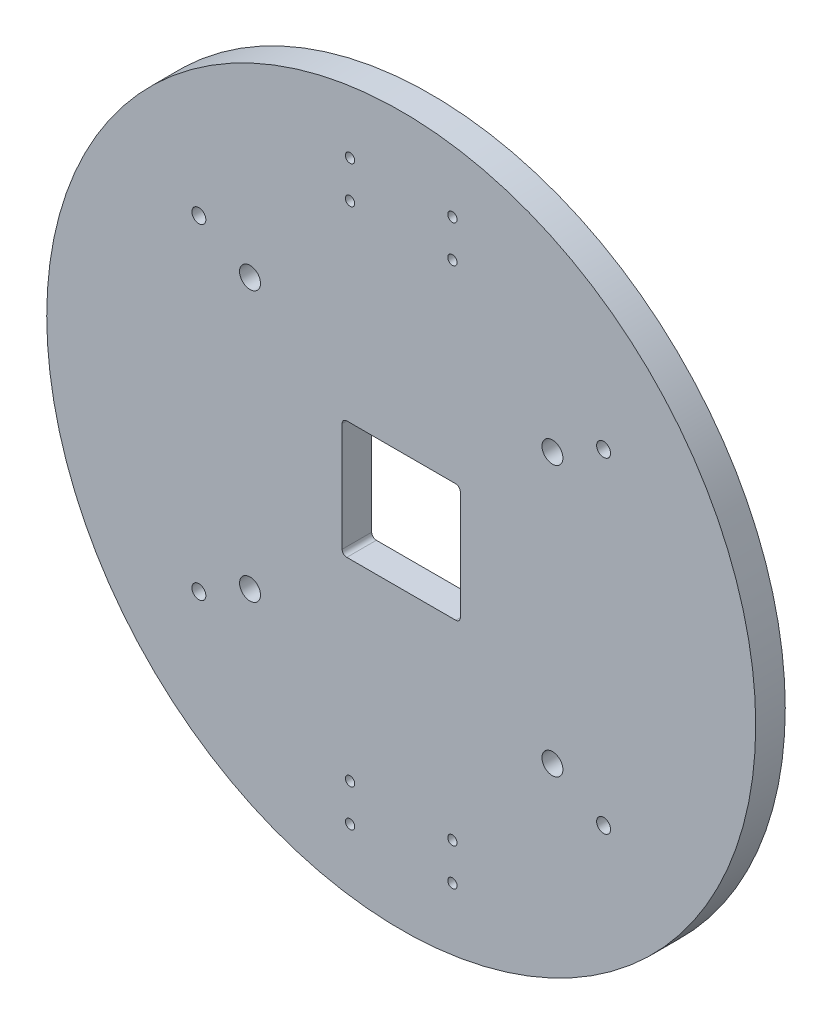
ISO-10303-21;
HEADER;
FILE_DESCRIPTION(('STEP AP214'),'2;1');
FILE_NAME('part.step','',(''),(''),'','','');
FILE_SCHEMA(('AUTOMOTIVE_DESIGN { 1 0 10303 214 1 1 1 1 }'));
ENDSEC;
DATA;
#1=APPLICATION_CONTEXT('core data for automotive mechanical design processes');
#2=APPLICATION_PROTOCOL_DEFINITION('international standard','automotive_design',2000,#1);
#3=PRODUCT_CONTEXT('',#1,'mechanical');
#4=PRODUCT('Part','Part','',(#3));
#5=PRODUCT_RELATED_PRODUCT_CATEGORY('part','',(#4));
#6=PRODUCT_DEFINITION_FORMATION('','',#4);
#7=PRODUCT_DEFINITION_CONTEXT('part definition',#1,'design');
#8=PRODUCT_DEFINITION('design','',#6,#7);
#9=PRODUCT_DEFINITION_SHAPE('','',#8);
#10=(LENGTH_UNIT() NAMED_UNIT(*) SI_UNIT(.MILLI.,.METRE.));
#11=(NAMED_UNIT(*) PLANE_ANGLE_UNIT() SI_UNIT($,.RADIAN.));
#12=(NAMED_UNIT(*) SI_UNIT($,.STERADIAN.) SOLID_ANGLE_UNIT());
#13=UNCERTAINTY_MEASURE_WITH_UNIT(LENGTH_MEASURE(1.E-05),#10,'distance_accuracy_value','');
#14=(GEOMETRIC_REPRESENTATION_CONTEXT(3) GLOBAL_UNCERTAINTY_ASSIGNED_CONTEXT((#13)) GLOBAL_UNIT_ASSIGNED_CONTEXT((#10,
#11,#12)) REPRESENTATION_CONTEXT('',''));
#15=CARTESIAN_POINT('',(0.,0.,0.));
#16=DIRECTION('',(0.,0.,1.));
#17=DIRECTION('',(1.,0.,0.));
#18=AXIS2_PLACEMENT_3D('',#15,#16,#17);
#19=CARTESIAN_POINT('',(0.,0.,6.35));
#20=DIRECTION('',(0.,0.,1.));
#21=DIRECTION('',(1.,0.,0.));
#22=AXIS2_PLACEMENT_3D('',#19,#20,#21);
#23=PLANE('',#22);
#24=CARTESIAN_POINT('',(11.,-62.,6.35));
#25=DIRECTION('',(0.,0.,1.));
#26=DIRECTION('',(1.,0.,0.));
#27=AXIS2_PLACEMENT_3D('',#24,#25,#26);
#28=CIRCLE('',#27,0.999999999999997);
#29=CARTESIAN_POINT('',(12.,-62.,6.35));
#30=VERTEX_POINT('',#29);
#31=EDGE_CURVE('E570',#30,#30,#28,.T.);
#32=ORIENTED_EDGE('',*,*,#31,.F.);
#33=EDGE_LOOP('',(#32));
#34=FACE_BOUND('',#33,.T.);
#35=CARTESIAN_POINT('',(-11.,-62.,6.35));
#36=DIRECTION('',(0.,0.,1.));
#37=DIRECTION('',(1.,0.,0.));
#38=AXIS2_PLACEMENT_3D('',#35,#36,#37);
#39=CIRCLE('',#38,1.00000000000001);
#40=CARTESIAN_POINT('',(-9.99999999999999,-62.,6.35));
#41=VERTEX_POINT('',#40);
#42=EDGE_CURVE('E582',#41,#41,#39,.T.);
#43=ORIENTED_EDGE('',*,*,#42,.F.);
#44=EDGE_LOOP('',(#43));
#45=FACE_BOUND('',#44,.T.);
#46=CARTESIAN_POINT('',(11.,62.,6.35));
#47=DIRECTION('',(0.,0.,1.));
#48=DIRECTION('',(1.,0.,0.));
#49=AXIS2_PLACEMENT_3D('',#46,#47,#48);
#50=CIRCLE('',#49,1.);
#51=CARTESIAN_POINT('',(12.,62.,6.35));
#52=VERTEX_POINT('',#51);
#53=EDGE_CURVE('E594',#52,#52,#50,.T.);
#54=ORIENTED_EDGE('',*,*,#53,.F.);
#55=EDGE_LOOP('',(#54));
#56=FACE_BOUND('',#55,.T.);
#57=CARTESIAN_POINT('',(-11.,54.,6.35));
#58=DIRECTION('',(0.,0.,1.));
#59=DIRECTION('',(1.,0.,0.));
#60=AXIS2_PLACEMENT_3D('',#57,#58,#59);
#61=CIRCLE('',#60,0.999999999999998);
#62=CARTESIAN_POINT('',(-10.,54.,6.35));
#63=VERTEX_POINT('',#62);
#64=EDGE_CURVE('E606',#63,#63,#61,.T.);
#65=ORIENTED_EDGE('',*,*,#64,.F.);
#66=EDGE_LOOP('',(#65));
#67=FACE_BOUND('',#66,.T.);
#68=CARTESIAN_POINT('',(-43.5,-35.,6.35));
#69=DIRECTION('',(0.,0.,1.));
#70=DIRECTION('',(1.,0.,0.));
#71=AXIS2_PLACEMENT_3D('',#68,#69,#70);
#72=CIRCLE('',#71,1.5);
#73=CARTESIAN_POINT('',(-42.,-35.,6.35));
#74=VERTEX_POINT('',#73);
#75=EDGE_CURVE('E618',#74,#74,#72,.T.);
#76=ORIENTED_EDGE('',*,*,#75,.F.);
#77=EDGE_LOOP('',(#76));
#78=FACE_BOUND('',#77,.T.);
#79=CARTESIAN_POINT('',(43.5,35.,6.35));
#80=DIRECTION('',(0.,0.,1.));
#81=DIRECTION('',(1.,0.,0.));
#82=AXIS2_PLACEMENT_3D('',#79,#80,#81);
#83=CIRCLE('',#82,1.5);
#84=CARTESIAN_POINT('',(45.,35.,6.35));
#85=VERTEX_POINT('',#84);
#86=EDGE_CURVE('E630',#85,#85,#83,.T.);
#87=ORIENTED_EDGE('',*,*,#86,.F.);
#88=EDGE_LOOP('',(#87));
#89=FACE_BOUND('',#88,.T.);
#90=CARTESIAN_POINT('',(-32.5,-29.,6.35));
#91=DIRECTION('',(0.,0.,1.));
#92=DIRECTION('',(1.,0.,0.));
#93=AXIS2_PLACEMENT_3D('',#90,#91,#92);
#94=CIRCLE('',#93,2.25);
#95=CARTESIAN_POINT('',(-30.25,-29.,6.35));
#96=VERTEX_POINT('',#95);
#97=EDGE_CURVE('E491',#96,#96,#94,.T.);
#98=ORIENTED_EDGE('',*,*,#97,.F.);
#99=EDGE_LOOP('',(#98));
#100=FACE_BOUND('',#99,.T.);
#101=CARTESIAN_POINT('',(32.5,29.,6.35));
#102=DIRECTION('',(0.,0.,1.));
#103=DIRECTION('',(1.,0.,0.));
#104=AXIS2_PLACEMENT_3D('',#101,#102,#103);
#105=CIRCLE('',#104,2.25);
#106=CARTESIAN_POINT('',(34.75,29.,6.35));
#107=VERTEX_POINT('',#106);
#108=EDGE_CURVE('E120',#107,#107,#105,.T.);
#109=ORIENTED_EDGE('',*,*,#108,.F.);
#110=EDGE_LOOP('',(#109));
#111=FACE_BOUND('',#110,.T.);
#112=CARTESIAN_POINT('',(0.,0.,6.35));
#113=DIRECTION('',(0.,0.,1.));
#114=DIRECTION('',(1.,0.,0.));
#115=AXIS2_PLACEMENT_3D('',#112,#113,#114);
#116=CIRCLE('',#115,76.2);
#117=CARTESIAN_POINT('',(76.2,0.,6.35));
#118=VERTEX_POINT('',#117);
#119=EDGE_CURVE('E137',#118,#118,#116,.T.);
#120=ORIENTED_EDGE('',*,*,#119,.T.);
#121=EDGE_LOOP('',(#120));
#122=FACE_BOUND('',#121,.T.);
#123=DIRECTION('',(1.,0.,0.));
#124=VECTOR('',#123,1.);
#125=CARTESIAN_POINT('',(12.7,-12.7,6.35));
#126=LINE('',#125,#124);
#127=CARTESIAN_POINT('',(-11.7,-12.7,6.35));
#128=VERTEX_POINT('',#127);
#129=CARTESIAN_POINT('',(11.7,-12.7,6.35));
#130=VERTEX_POINT('',#129);
#131=EDGE_CURVE('E186',#128,#130,#126,.T.);
#132=ORIENTED_EDGE('',*,*,#131,.F.);
#133=CARTESIAN_POINT('',(-11.7,-11.7,6.35));
#134=DIRECTION('',(0.,0.,1.));
#135=DIRECTION('',(1.,0.,0.));
#136=AXIS2_PLACEMENT_3D('',#133,#134,#135);
#137=CIRCLE('',#136,1.);
#138=CARTESIAN_POINT('',(-12.7,-11.7,6.35));
#139=VERTEX_POINT('',#138);
#140=EDGE_CURVE('E130',#128,#139,#137,.F.);
#141=ORIENTED_EDGE('',*,*,#140,.T.);
#142=DIRECTION('',(0.,-1.,0.));
#143=VECTOR('',#142,1.);
#144=CARTESIAN_POINT('',(-12.7,12.7,6.35));
#145=LINE('',#144,#143);
#146=CARTESIAN_POINT('',(-12.7,11.7,6.35));
#147=VERTEX_POINT('',#146);
#148=EDGE_CURVE('E134',#147,#139,#145,.T.);
#149=ORIENTED_EDGE('',*,*,#148,.F.);
#150=CARTESIAN_POINT('',(-11.7,11.7,6.35));
#151=DIRECTION('',(0.,0.,1.));
#152=DIRECTION('',(1.,0.,0.));
#153=AXIS2_PLACEMENT_3D('',#150,#151,#152);
#154=CIRCLE('',#153,1.);
#155=CARTESIAN_POINT('',(-11.7,12.7,6.35));
#156=VERTEX_POINT('',#155);
#157=EDGE_CURVE('E172',#147,#156,#154,.F.);
#158=ORIENTED_EDGE('',*,*,#157,.T.);
#159=DIRECTION('',(-1.,0.,0.));
#160=VECTOR('',#159,1.);
#161=CARTESIAN_POINT('',(12.7,12.7,6.35));
#162=LINE('',#161,#160);
#163=CARTESIAN_POINT('',(11.7,12.7,6.35));
#164=VERTEX_POINT('',#163);
#165=EDGE_CURVE('E209',#164,#156,#162,.T.);
#166=ORIENTED_EDGE('',*,*,#165,.F.);
#167=CARTESIAN_POINT('',(11.7,11.7,6.35));
#168=DIRECTION('',(0.,0.,1.));
#169=DIRECTION('',(1.,0.,0.));
#170=AXIS2_PLACEMENT_3D('',#167,#168,#169);
#171=CIRCLE('',#170,1.);
#172=CARTESIAN_POINT('',(12.7,11.7,6.35));
#173=VERTEX_POINT('',#172);
#174=EDGE_CURVE('E159',#164,#173,#171,.F.);
#175=ORIENTED_EDGE('',*,*,#174,.T.);
#176=DIRECTION('',(0.,1.,0.));
#177=VECTOR('',#176,1.);
#178=CARTESIAN_POINT('',(12.7,12.7,6.35));
#179=LINE('',#178,#177);
#180=CARTESIAN_POINT('',(12.7,-11.7,6.35));
#181=VERTEX_POINT('',#180);
#182=EDGE_CURVE('E202',#181,#173,#179,.T.);
#183=ORIENTED_EDGE('',*,*,#182,.F.);
#184=CARTESIAN_POINT('',(11.7,-11.7,6.35));
#185=DIRECTION('',(0.,0.,1.));
#186=DIRECTION('',(1.,0.,0.));
#187=AXIS2_PLACEMENT_3D('',#184,#185,#186);
#188=CIRCLE('',#187,1.);
#189=EDGE_CURVE('E11',#181,#130,#188,.F.);
#190=ORIENTED_EDGE('',*,*,#189,.T.);
#191=EDGE_LOOP('',(#132,#141,#149,#158,#166,#175,#183,#190));
#192=FACE_BOUND('',#191,.T.);
#193=CARTESIAN_POINT('',(-32.5,29.,6.35));
#194=DIRECTION('',(0.,0.,1.));
#195=DIRECTION('',(1.,0.,0.));
#196=AXIS2_PLACEMENT_3D('',#193,#194,#195);
#197=CIRCLE('',#196,2.25);
#198=CARTESIAN_POINT('',(-30.25,29.,6.35));
#199=VERTEX_POINT('',#198);
#200=EDGE_CURVE('E485',#199,#199,#197,.T.);
#201=ORIENTED_EDGE('',*,*,#200,.F.);
#202=EDGE_LOOP('',(#201));
#203=FACE_BOUND('',#202,.T.);
#204=CARTESIAN_POINT('',(32.5,-29.,6.35));
#205=DIRECTION('',(0.,0.,1.));
#206=DIRECTION('',(1.,0.,0.));
#207=AXIS2_PLACEMENT_3D('',#204,#205,#206);
#208=CIRCLE('',#207,2.25);
#209=CARTESIAN_POINT('',(34.75,-29.,6.35));
#210=VERTEX_POINT('',#209);
#211=EDGE_CURVE('E636',#210,#210,#208,.T.);
#212=ORIENTED_EDGE('',*,*,#211,.F.);
#213=EDGE_LOOP('',(#212));
#214=FACE_BOUND('',#213,.T.);
#215=CARTESIAN_POINT('',(-43.5,35.,6.35));
#216=DIRECTION('',(0.,0.,1.));
#217=DIRECTION('',(1.,0.,0.));
#218=AXIS2_PLACEMENT_3D('',#215,#216,#217);
#219=CIRCLE('',#218,1.5);
#220=CARTESIAN_POINT('',(-42.,35.,6.35));
#221=VERTEX_POINT('',#220);
#222=EDGE_CURVE('E624',#221,#221,#219,.T.);
#223=ORIENTED_EDGE('',*,*,#222,.F.);
#224=EDGE_LOOP('',(#223));
#225=FACE_BOUND('',#224,.T.);
#226=CARTESIAN_POINT('',(43.5,-35.,6.35));
#227=DIRECTION('',(0.,0.,1.));
#228=DIRECTION('',(1.,0.,0.));
#229=AXIS2_PLACEMENT_3D('',#226,#227,#228);
#230=CIRCLE('',#229,1.5);
#231=CARTESIAN_POINT('',(45.,-35.,6.35));
#232=VERTEX_POINT('',#231);
#233=EDGE_CURVE('E612',#232,#232,#230,.T.);
#234=ORIENTED_EDGE('',*,*,#233,.F.);
#235=EDGE_LOOP('',(#234));
#236=FACE_BOUND('',#235,.T.);
#237=CARTESIAN_POINT('',(11.,54.,6.35));
#238=DIRECTION('',(0.,0.,1.));
#239=DIRECTION('',(1.,0.,0.));
#240=AXIS2_PLACEMENT_3D('',#237,#238,#239);
#241=CIRCLE('',#240,1.);
#242=CARTESIAN_POINT('',(12.,54.,6.35));
#243=VERTEX_POINT('',#242);
#244=EDGE_CURVE('E600',#243,#243,#241,.T.);
#245=ORIENTED_EDGE('',*,*,#244,.F.);
#246=EDGE_LOOP('',(#245));
#247=FACE_BOUND('',#246,.T.);
#248=CARTESIAN_POINT('',(-11.,62.,6.35));
#249=DIRECTION('',(0.,0.,1.));
#250=DIRECTION('',(1.,0.,0.));
#251=AXIS2_PLACEMENT_3D('',#248,#249,#250);
#252=CIRCLE('',#251,1.);
#253=CARTESIAN_POINT('',(-10.,62.,6.35));
#254=VERTEX_POINT('',#253);
#255=EDGE_CURVE('E588',#254,#254,#252,.T.);
#256=ORIENTED_EDGE('',*,*,#255,.F.);
#257=EDGE_LOOP('',(#256));
#258=FACE_BOUND('',#257,.T.);
#259=CARTESIAN_POINT('',(-11.,-54.,6.35));
#260=DIRECTION('',(0.,0.,1.));
#261=DIRECTION('',(1.,0.,0.));
#262=AXIS2_PLACEMENT_3D('',#259,#260,#261);
#263=CIRCLE('',#262,1.);
#264=CARTESIAN_POINT('',(-9.99999999999999,-54.,6.35));
#265=VERTEX_POINT('',#264);
#266=EDGE_CURVE('E576',#265,#265,#263,.T.);
#267=ORIENTED_EDGE('',*,*,#266,.F.);
#268=EDGE_LOOP('',(#267));
#269=FACE_BOUND('',#268,.T.);
#270=CARTESIAN_POINT('',(11.,-54.,6.35));
#271=DIRECTION('',(0.,0.,1.));
#272=DIRECTION('',(1.,0.,0.));
#273=AXIS2_PLACEMENT_3D('',#270,#271,#272);
#274=CIRCLE('',#273,1.);
#275=CARTESIAN_POINT('',(12.,-54.,6.35));
#276=VERTEX_POINT('',#275);
#277=EDGE_CURVE('E564',#276,#276,#274,.T.);
#278=ORIENTED_EDGE('',*,*,#277,.F.);
#279=EDGE_LOOP('',(#278));
#280=FACE_BOUND('',#279,.T.);
#281=ADVANCED_FACE('F45',(#34,#45,#56,#67,#78,#89,#100,#111,#122,#192,#203,#214,#225,#236,#247,
#258,#269,#280),#23,.T.);
#282=CARTESIAN_POINT('',(0.,0.,0.));
#283=DIRECTION('',(0.,0.,1.));
#284=DIRECTION('',(1.,0.,0.));
#285=AXIS2_PLACEMENT_3D('',#282,#283,#284);
#286=PLANE('',#285);
#287=CARTESIAN_POINT('',(0.,0.,0.));
#288=DIRECTION('',(0.,0.,1.));
#289=DIRECTION('',(1.,0.,0.));
#290=AXIS2_PLACEMENT_3D('',#287,#288,#289);
#291=CIRCLE('',#290,76.2);
#292=CARTESIAN_POINT('',(76.2,0.,0.));
#293=VERTEX_POINT('',#292);
#294=EDGE_CURVE('E143',#293,#293,#291,.T.);
#295=ORIENTED_EDGE('',*,*,#294,.F.);
#296=EDGE_LOOP('',(#295));
#297=FACE_BOUND('',#296,.T.);
#298=DIRECTION('',(-1.,0.,0.));
#299=VECTOR('',#298,1.);
#300=CARTESIAN_POINT('',(12.7,12.7,0.));
#301=LINE('',#300,#299);
#302=CARTESIAN_POINT('',(11.7,12.7,0.));
#303=VERTEX_POINT('',#302);
#304=CARTESIAN_POINT('',(-11.7,12.7,0.));
#305=VERTEX_POINT('',#304);
#306=EDGE_CURVE('E193',#303,#305,#301,.T.);
#307=ORIENTED_EDGE('',*,*,#306,.T.);
#308=CARTESIAN_POINT('',(-11.7,11.7,0.));
#309=DIRECTION('',(0.,0.,1.));
#310=DIRECTION('',(1.,0.,0.));
#311=AXIS2_PLACEMENT_3D('',#308,#309,#310);
#312=CIRCLE('',#311,1.);
#313=CARTESIAN_POINT('',(-12.7,11.7,0.));
#314=VERTEX_POINT('',#313);
#315=EDGE_CURVE('E114',#305,#314,#312,.T.);
#316=ORIENTED_EDGE('',*,*,#315,.T.);
#317=DIRECTION('',(0.,-1.,0.));
#318=VECTOR('',#317,1.);
#319=CARTESIAN_POINT('',(-12.7,12.7,0.));
#320=LINE('',#319,#318);
#321=CARTESIAN_POINT('',(-12.7,-11.7,0.));
#322=VERTEX_POINT('',#321);
#323=EDGE_CURVE('E107',#314,#322,#320,.T.);
#324=ORIENTED_EDGE('',*,*,#323,.T.);
#325=CARTESIAN_POINT('',(-11.7,-11.7,0.));
#326=DIRECTION('',(0.,0.,1.));
#327=DIRECTION('',(1.,0.,0.));
#328=AXIS2_PLACEMENT_3D('',#325,#326,#327);
#329=CIRCLE('',#328,1.);
#330=CARTESIAN_POINT('',(-11.7,-12.7,0.));
#331=VERTEX_POINT('',#330);
#332=EDGE_CURVE('E112',#322,#331,#329,.T.);
#333=ORIENTED_EDGE('',*,*,#332,.T.);
#334=DIRECTION('',(1.,0.,0.));
#335=VECTOR('',#334,1.);
#336=CARTESIAN_POINT('',(12.7,-12.7,0.));
#337=LINE('',#336,#335);
#338=CARTESIAN_POINT('',(11.7,-12.7,0.));
#339=VERTEX_POINT('',#338);
#340=EDGE_CURVE('E119',#331,#339,#337,.T.);
#341=ORIENTED_EDGE('',*,*,#340,.T.);
#342=CARTESIAN_POINT('',(11.7,-11.7,0.));
#343=DIRECTION('',(0.,0.,1.));
#344=DIRECTION('',(1.,0.,0.));
#345=AXIS2_PLACEMENT_3D('',#342,#343,#344);
#346=CIRCLE('',#345,1.);
#347=CARTESIAN_POINT('',(12.7,-11.7,0.));
#348=VERTEX_POINT('',#347);
#349=EDGE_CURVE('E54',#339,#348,#346,.T.);
#350=ORIENTED_EDGE('',*,*,#349,.T.);
#351=DIRECTION('',(0.,1.,0.));
#352=VECTOR('',#351,1.);
#353=CARTESIAN_POINT('',(12.7,12.7,0.));
#354=LINE('',#353,#352);
#355=CARTESIAN_POINT('',(12.7,11.7,0.));
#356=VERTEX_POINT('',#355);
#357=EDGE_CURVE('E190',#348,#356,#354,.T.);
#358=ORIENTED_EDGE('',*,*,#357,.T.);
#359=CARTESIAN_POINT('',(11.7,11.7,0.));
#360=DIRECTION('',(0.,0.,1.));
#361=DIRECTION('',(1.,0.,0.));
#362=AXIS2_PLACEMENT_3D('',#359,#360,#361);
#363=CIRCLE('',#362,1.);
#364=EDGE_CURVE('E156',#356,#303,#363,.T.);
#365=ORIENTED_EDGE('',*,*,#364,.T.);
#366=EDGE_LOOP('',(#307,#316,#324,#333,#341,#350,#358,#365));
#367=FACE_BOUND('',#366,.T.);
#368=CARTESIAN_POINT('',(32.5,29.,0.));
#369=DIRECTION('',(0.,0.,1.));
#370=DIRECTION('',(1.,0.,0.));
#371=AXIS2_PLACEMENT_3D('',#368,#369,#370);
#372=CIRCLE('',#371,2.25);
#373=CARTESIAN_POINT('',(34.75,29.,0.));
#374=VERTEX_POINT('',#373);
#375=EDGE_CURVE('E205',#374,#374,#372,.T.);
#376=ORIENTED_EDGE('',*,*,#375,.T.);
#377=EDGE_LOOP('',(#376));
#378=FACE_BOUND('',#377,.T.);
#379=CARTESIAN_POINT('',(-32.5,29.,0.));
#380=DIRECTION('',(0.,0.,1.));
#381=DIRECTION('',(1.,0.,0.));
#382=AXIS2_PLACEMENT_3D('',#379,#380,#381);
#383=CIRCLE('',#382,2.25);
#384=CARTESIAN_POINT('',(-30.25,29.,0.));
#385=VERTEX_POINT('',#384);
#386=EDGE_CURVE('E488',#385,#385,#383,.T.);
#387=ORIENTED_EDGE('',*,*,#386,.T.);
#388=EDGE_LOOP('',(#387));
#389=FACE_BOUND('',#388,.T.);
#390=CARTESIAN_POINT('',(-32.5,-29.,0.));
#391=DIRECTION('',(0.,0.,1.));
#392=DIRECTION('',(1.,0.,0.));
#393=AXIS2_PLACEMENT_3D('',#390,#391,#392);
#394=CIRCLE('',#393,2.25);
#395=CARTESIAN_POINT('',(-30.25,-29.,0.));
#396=VERTEX_POINT('',#395);
#397=EDGE_CURVE('E497',#396,#396,#394,.T.);
#398=ORIENTED_EDGE('',*,*,#397,.T.);
#399=EDGE_LOOP('',(#398));
#400=FACE_BOUND('',#399,.T.);
#401=CARTESIAN_POINT('',(32.5,-29.,0.));
#402=DIRECTION('',(0.,0.,1.));
#403=DIRECTION('',(1.,0.,0.));
#404=AXIS2_PLACEMENT_3D('',#401,#402,#403);
#405=CIRCLE('',#404,2.25);
#406=CARTESIAN_POINT('',(34.75,-29.,0.));
#407=VERTEX_POINT('',#406);
#408=EDGE_CURVE('E514',#407,#407,#405,.T.);
#409=ORIENTED_EDGE('',*,*,#408,.T.);
#410=EDGE_LOOP('',(#409));
#411=FACE_BOUND('',#410,.T.);
#412=CARTESIAN_POINT('',(43.5,35.,0.));
#413=DIRECTION('',(0.,0.,1.));
#414=DIRECTION('',(1.,0.,0.));
#415=AXIS2_PLACEMENT_3D('',#412,#413,#414);
#416=CIRCLE('',#415,1.5);
#417=CARTESIAN_POINT('',(45.,35.,0.));
#418=VERTEX_POINT('',#417);
#419=EDGE_CURVE('E518',#418,#418,#416,.T.);
#420=ORIENTED_EDGE('',*,*,#419,.T.);
#421=EDGE_LOOP('',(#420));
#422=FACE_BOUND('',#421,.T.);
#423=CARTESIAN_POINT('',(-43.5,35.,0.));
#424=DIRECTION('',(0.,0.,1.));
#425=DIRECTION('',(1.,0.,0.));
#426=AXIS2_PLACEMENT_3D('',#423,#424,#425);
#427=CIRCLE('',#426,1.5);
#428=CARTESIAN_POINT('',(-42.,35.,0.));
#429=VERTEX_POINT('',#428);
#430=EDGE_CURVE('E522',#429,#429,#427,.T.);
#431=ORIENTED_EDGE('',*,*,#430,.T.);
#432=EDGE_LOOP('',(#431));
#433=FACE_BOUND('',#432,.T.);
#434=CARTESIAN_POINT('',(-43.5,-35.,0.));
#435=DIRECTION('',(0.,0.,1.));
#436=DIRECTION('',(1.,0.,0.));
#437=AXIS2_PLACEMENT_3D('',#434,#435,#436);
#438=CIRCLE('',#437,1.5);
#439=CARTESIAN_POINT('',(-42.,-35.,0.));
#440=VERTEX_POINT('',#439);
#441=EDGE_CURVE('E526',#440,#440,#438,.T.);
#442=ORIENTED_EDGE('',*,*,#441,.T.);
#443=EDGE_LOOP('',(#442));
#444=FACE_BOUND('',#443,.T.);
#445=CARTESIAN_POINT('',(43.5,-35.,0.));
#446=DIRECTION('',(0.,0.,1.));
#447=DIRECTION('',(1.,0.,0.));
#448=AXIS2_PLACEMENT_3D('',#445,#446,#447);
#449=CIRCLE('',#448,1.5);
#450=CARTESIAN_POINT('',(45.,-35.,0.));
#451=VERTEX_POINT('',#450);
#452=EDGE_CURVE('E530',#451,#451,#449,.T.);
#453=ORIENTED_EDGE('',*,*,#452,.T.);
#454=EDGE_LOOP('',(#453));
#455=FACE_BOUND('',#454,.T.);
#456=CARTESIAN_POINT('',(-11.,54.,0.));
#457=DIRECTION('',(0.,0.,1.));
#458=DIRECTION('',(1.,0.,0.));
#459=AXIS2_PLACEMENT_3D('',#456,#457,#458);
#460=CIRCLE('',#459,0.999999999999998);
#461=CARTESIAN_POINT('',(-10.,54.,0.));
#462=VERTEX_POINT('',#461);
#463=EDGE_CURVE('E534',#462,#462,#460,.T.);
#464=ORIENTED_EDGE('',*,*,#463,.T.);
#465=EDGE_LOOP('',(#464));
#466=FACE_BOUND('',#465,.T.);
#467=CARTESIAN_POINT('',(11.,54.,0.));
#468=DIRECTION('',(0.,0.,1.));
#469=DIRECTION('',(1.,0.,0.));
#470=AXIS2_PLACEMENT_3D('',#467,#468,#469);
#471=CIRCLE('',#470,1.);
#472=CARTESIAN_POINT('',(12.,54.,0.));
#473=VERTEX_POINT('',#472);
#474=EDGE_CURVE('E538',#473,#473,#471,.T.);
#475=ORIENTED_EDGE('',*,*,#474,.T.);
#476=EDGE_LOOP('',(#475));
#477=FACE_BOUND('',#476,.T.);
#478=CARTESIAN_POINT('',(11.,62.,0.));
#479=DIRECTION('',(0.,0.,1.));
#480=DIRECTION('',(1.,0.,0.));
#481=AXIS2_PLACEMENT_3D('',#478,#479,#480);
#482=CIRCLE('',#481,1.);
#483=CARTESIAN_POINT('',(12.,62.,0.));
#484=VERTEX_POINT('',#483);
#485=EDGE_CURVE('E542',#484,#484,#482,.T.);
#486=ORIENTED_EDGE('',*,*,#485,.T.);
#487=EDGE_LOOP('',(#486));
#488=FACE_BOUND('',#487,.T.);
#489=CARTESIAN_POINT('',(-11.,62.,0.));
#490=DIRECTION('',(0.,0.,1.));
#491=DIRECTION('',(1.,0.,0.));
#492=AXIS2_PLACEMENT_3D('',#489,#490,#491);
#493=CIRCLE('',#492,1.);
#494=CARTESIAN_POINT('',(-10.,62.,0.));
#495=VERTEX_POINT('',#494);
#496=EDGE_CURVE('E546',#495,#495,#493,.T.);
#497=ORIENTED_EDGE('',*,*,#496,.T.);
#498=EDGE_LOOP('',(#497));
#499=FACE_BOUND('',#498,.T.);
#500=CARTESIAN_POINT('',(-11.,-62.,0.));
#501=DIRECTION('',(0.,0.,1.));
#502=DIRECTION('',(1.,0.,0.));
#503=AXIS2_PLACEMENT_3D('',#500,#501,#502);
#504=CIRCLE('',#503,1.00000000000001);
#505=CARTESIAN_POINT('',(-9.99999999999999,-62.,0.));
#506=VERTEX_POINT('',#505);
#507=EDGE_CURVE('E550',#506,#506,#504,.T.);
#508=ORIENTED_EDGE('',*,*,#507,.T.);
#509=EDGE_LOOP('',(#508));
#510=FACE_BOUND('',#509,.T.);
#511=CARTESIAN_POINT('',(-11.,-54.,0.));
#512=DIRECTION('',(0.,0.,1.));
#513=DIRECTION('',(1.,0.,0.));
#514=AXIS2_PLACEMENT_3D('',#511,#512,#513);
#515=CIRCLE('',#514,1.);
#516=CARTESIAN_POINT('',(-9.99999999999999,-54.,0.));
#517=VERTEX_POINT('',#516);
#518=EDGE_CURVE('E554',#517,#517,#515,.T.);
#519=ORIENTED_EDGE('',*,*,#518,.T.);
#520=EDGE_LOOP('',(#519));
#521=FACE_BOUND('',#520,.T.);
#522=CARTESIAN_POINT('',(11.,-62.,0.));
#523=DIRECTION('',(0.,0.,1.));
#524=DIRECTION('',(1.,0.,0.));
#525=AXIS2_PLACEMENT_3D('',#522,#523,#524);
#526=CIRCLE('',#525,0.999999999999997);
#527=CARTESIAN_POINT('',(12.,-62.,0.));
#528=VERTEX_POINT('',#527);
#529=EDGE_CURVE('E558',#528,#528,#526,.T.);
#530=ORIENTED_EDGE('',*,*,#529,.T.);
#531=EDGE_LOOP('',(#530));
#532=FACE_BOUND('',#531,.T.);
#533=CARTESIAN_POINT('',(11.,-54.,0.));
#534=DIRECTION('',(0.,0.,1.));
#535=DIRECTION('',(1.,0.,0.));
#536=AXIS2_PLACEMENT_3D('',#533,#534,#535);
#537=CIRCLE('',#536,1.);
#538=CARTESIAN_POINT('',(12.,-54.,0.));
#539=VERTEX_POINT('',#538);
#540=EDGE_CURVE('E561',#539,#539,#537,.T.);
#541=ORIENTED_EDGE('',*,*,#540,.T.);
#542=EDGE_LOOP('',(#541));
#543=FACE_BOUND('',#542,.T.);
#544=ADVANCED_FACE('F110',(#297,#367,#378,#389,#400,#411,#422,#433,#444,#455,#466,#477,#488,
#499,#510,#521,#532,#543),#286,.F.);
#545=CARTESIAN_POINT('',(0.,0.,6.35));
#546=DIRECTION('',(0.,0.,-1.));
#547=DIRECTION('',(-1.,0.,0.));
#548=AXIS2_PLACEMENT_3D('',#545,#546,#547);
#549=CYLINDRICAL_SURFACE('',#548,76.2);
#550=ORIENTED_EDGE('',*,*,#119,.F.);
#551=EDGE_LOOP('',(#550));
#552=FACE_BOUND('',#551,.T.);
#553=ORIENTED_EDGE('',*,*,#294,.T.);
#554=EDGE_LOOP('',(#553));
#555=FACE_BOUND('',#554,.T.);
#556=ADVANCED_FACE('F219',(#552,#555),#549,.T.);
#557=CARTESIAN_POINT('',(-12.7,12.7,6.35));
#558=DIRECTION('',(1.,0.,0.));
#559=DIRECTION('',(0.,1.,0.));
#560=AXIS2_PLACEMENT_3D('',#557,#558,#559);
#561=PLANE('',#560);
#562=ORIENTED_EDGE('',*,*,#323,.F.);
#563=DIRECTION('',(0.,0.,-1.));
#564=VECTOR('',#563,1.);
#565=CARTESIAN_POINT('',(-12.7,11.7,6.35));
#566=LINE('',#565,#564);
#567=EDGE_CURVE('E167',#314,#147,#566,.F.);
#568=ORIENTED_EDGE('',*,*,#567,.T.);
#569=ORIENTED_EDGE('',*,*,#148,.T.);
#570=DIRECTION('',(0.,0.,-1.));
#571=VECTOR('',#570,1.);
#572=CARTESIAN_POINT('',(-12.7,-11.7,0.));
#573=LINE('',#572,#571);
#574=EDGE_CURVE('E127',#139,#322,#573,.T.);
#575=ORIENTED_EDGE('',*,*,#574,.T.);
#576=EDGE_LOOP('',(#562,#568,#569,#575));
#577=FACE_BOUND('',#576,.T.);
#578=ADVANCED_FACE('F132',(#577),#561,.T.);
#579=CARTESIAN_POINT('',(12.7,-12.7,6.35));
#580=DIRECTION('',(0.,1.,0.));
#581=DIRECTION('',(-1.,0.,0.));
#582=AXIS2_PLACEMENT_3D('',#579,#580,#581);
#583=PLANE('',#582);
#584=ORIENTED_EDGE('',*,*,#131,.T.);
#585=DIRECTION('',(0.,0.,-1.));
#586=VECTOR('',#585,1.);
#587=CARTESIAN_POINT('',(11.7,-12.7,0.));
#588=LINE('',#587,#586);
#589=EDGE_CURVE('E175',#130,#339,#588,.T.);
#590=ORIENTED_EDGE('',*,*,#589,.T.);
#591=ORIENTED_EDGE('',*,*,#340,.F.);
#592=DIRECTION('',(0.,0.,-1.));
#593=VECTOR('',#592,1.);
#594=CARTESIAN_POINT('',(-11.7,-12.7,6.35));
#595=LINE('',#594,#593);
#596=EDGE_CURVE('E128',#331,#128,#595,.F.);
#597=ORIENTED_EDGE('',*,*,#596,.T.);
#598=EDGE_LOOP('',(#584,#590,#591,#597));
#599=FACE_BOUND('',#598,.T.);
#600=ADVANCED_FACE('F184',(#599),#583,.T.);
#601=CARTESIAN_POINT('',(12.7,12.7,6.35));
#602=DIRECTION('',(-1.,0.,0.));
#603=DIRECTION('',(0.,-1.,0.));
#604=AXIS2_PLACEMENT_3D('',#601,#602,#603);
#605=PLANE('',#604);
#606=ORIENTED_EDGE('',*,*,#357,.F.);
#607=DIRECTION('',(0.,0.,-1.));
#608=VECTOR('',#607,1.);
#609=CARTESIAN_POINT('',(12.7,-11.7,6.35));
#610=LINE('',#609,#608);
#611=EDGE_CURVE('E67',#348,#181,#610,.F.);
#612=ORIENTED_EDGE('',*,*,#611,.T.);
#613=ORIENTED_EDGE('',*,*,#182,.T.);
#614=DIRECTION('',(0.,0.,-1.));
#615=VECTOR('',#614,1.);
#616=CARTESIAN_POINT('',(12.7,11.7,0.));
#617=LINE('',#616,#615);
#618=EDGE_CURVE('E149',#173,#356,#617,.T.);
#619=ORIENTED_EDGE('',*,*,#618,.T.);
#620=EDGE_LOOP('',(#606,#612,#613,#619));
#621=FACE_BOUND('',#620,.T.);
#622=ADVANCED_FACE('F252',(#621),#605,.T.);
#623=CARTESIAN_POINT('',(12.7,12.7,6.35));
#624=DIRECTION('',(0.,-1.,0.));
#625=DIRECTION('',(1.,0.,0.));
#626=AXIS2_PLACEMENT_3D('',#623,#624,#625);
#627=PLANE('',#626);
#628=ORIENTED_EDGE('',*,*,#165,.T.);
#629=DIRECTION('',(0.,0.,-1.));
#630=VECTOR('',#629,1.);
#631=CARTESIAN_POINT('',(-11.7,12.7,0.));
#632=LINE('',#631,#630);
#633=EDGE_CURVE('E163',#156,#305,#632,.T.);
#634=ORIENTED_EDGE('',*,*,#633,.T.);
#635=ORIENTED_EDGE('',*,*,#306,.F.);
#636=DIRECTION('',(0.,0.,-1.));
#637=VECTOR('',#636,1.);
#638=CARTESIAN_POINT('',(11.7,12.7,6.35));
#639=LINE('',#638,#637);
#640=EDGE_CURVE('E153',#303,#164,#639,.F.);
#641=ORIENTED_EDGE('',*,*,#640,.T.);
#642=EDGE_LOOP('',(#628,#634,#635,#641));
#643=FACE_BOUND('',#642,.T.);
#644=ADVANCED_FACE('F255',(#643),#627,.T.);
#645=CARTESIAN_POINT('',(32.5,29.,6.35));
#646=DIRECTION('',(0.,0.,-1.));
#647=DIRECTION('',(-1.,0.,0.));
#648=AXIS2_PLACEMENT_3D('',#645,#646,#647);
#649=CYLINDRICAL_SURFACE('',#648,2.25);
#650=ORIENTED_EDGE('',*,*,#108,.T.);
#651=EDGE_LOOP('',(#650));
#652=FACE_BOUND('',#651,.T.);
#653=ORIENTED_EDGE('',*,*,#375,.F.);
#654=EDGE_LOOP('',(#653));
#655=FACE_BOUND('',#654,.T.);
#656=ADVANCED_FACE('F256',(#652,#655),#649,.F.);
#657=CARTESIAN_POINT('',(-32.5,29.,6.35));
#658=DIRECTION('',(0.,0.,-1.));
#659=DIRECTION('',(-1.,0.,0.));
#660=AXIS2_PLACEMENT_3D('',#657,#658,#659);
#661=CYLINDRICAL_SURFACE('',#660,2.25);
#662=ORIENTED_EDGE('',*,*,#200,.T.);
#663=EDGE_LOOP('',(#662));
#664=FACE_BOUND('',#663,.T.);
#665=ORIENTED_EDGE('',*,*,#386,.F.);
#666=EDGE_LOOP('',(#665));
#667=FACE_BOUND('',#666,.T.);
#668=ADVANCED_FACE('F262',(#664,#667),#661,.F.);
#669=CARTESIAN_POINT('',(-32.5,-29.,6.35));
#670=DIRECTION('',(0.,0.,-1.));
#671=DIRECTION('',(-1.,0.,0.));
#672=AXIS2_PLACEMENT_3D('',#669,#670,#671);
#673=CYLINDRICAL_SURFACE('',#672,2.25);
#674=ORIENTED_EDGE('',*,*,#97,.T.);
#675=EDGE_LOOP('',(#674));
#676=FACE_BOUND('',#675,.T.);
#677=ORIENTED_EDGE('',*,*,#397,.F.);
#678=EDGE_LOOP('',(#677));
#679=FACE_BOUND('',#678,.T.);
#680=ADVANCED_FACE('F398',(#676,#679),#673,.F.);
#681=CARTESIAN_POINT('',(32.5,-29.,6.35));
#682=DIRECTION('',(0.,0.,-1.));
#683=DIRECTION('',(-1.,0.,0.));
#684=AXIS2_PLACEMENT_3D('',#681,#682,#683);
#685=CYLINDRICAL_SURFACE('',#684,2.25);
#686=ORIENTED_EDGE('',*,*,#211,.T.);
#687=EDGE_LOOP('',(#686));
#688=FACE_BOUND('',#687,.T.);
#689=ORIENTED_EDGE('',*,*,#408,.F.);
#690=EDGE_LOOP('',(#689));
#691=FACE_BOUND('',#690,.T.);
#692=ADVANCED_FACE('F389',(#688,#691),#685,.F.);
#693=CARTESIAN_POINT('',(43.5,35.,6.35));
#694=DIRECTION('',(0.,0.,-1.));
#695=DIRECTION('',(-1.,0.,0.));
#696=AXIS2_PLACEMENT_3D('',#693,#694,#695);
#697=CYLINDRICAL_SURFACE('',#696,1.5);
#698=ORIENTED_EDGE('',*,*,#86,.T.);
#699=EDGE_LOOP('',(#698));
#700=FACE_BOUND('',#699,.T.);
#701=ORIENTED_EDGE('',*,*,#419,.F.);
#702=EDGE_LOOP('',(#701));
#703=FACE_BOUND('',#702,.T.);
#704=ADVANCED_FACE('F380',(#700,#703),#697,.F.);
#705=CARTESIAN_POINT('',(-43.5,35.,6.35));
#706=DIRECTION('',(0.,0.,-1.));
#707=DIRECTION('',(-1.,0.,0.));
#708=AXIS2_PLACEMENT_3D('',#705,#706,#707);
#709=CYLINDRICAL_SURFACE('',#708,1.5);
#710=ORIENTED_EDGE('',*,*,#222,.T.);
#711=EDGE_LOOP('',(#710));
#712=FACE_BOUND('',#711,.T.);
#713=ORIENTED_EDGE('',*,*,#430,.F.);
#714=EDGE_LOOP('',(#713));
#715=FACE_BOUND('',#714,.T.);
#716=ADVANCED_FACE('F371',(#712,#715),#709,.F.);
#717=CARTESIAN_POINT('',(-43.5,-35.,6.35));
#718=DIRECTION('',(0.,0.,-1.));
#719=DIRECTION('',(-1.,0.,0.));
#720=AXIS2_PLACEMENT_3D('',#717,#718,#719);
#721=CYLINDRICAL_SURFACE('',#720,1.5);
#722=ORIENTED_EDGE('',*,*,#75,.T.);
#723=EDGE_LOOP('',(#722));
#724=FACE_BOUND('',#723,.T.);
#725=ORIENTED_EDGE('',*,*,#441,.F.);
#726=EDGE_LOOP('',(#725));
#727=FACE_BOUND('',#726,.T.);
#728=ADVANCED_FACE('F362',(#724,#727),#721,.F.);
#729=CARTESIAN_POINT('',(43.5,-35.,6.35));
#730=DIRECTION('',(0.,0.,-1.));
#731=DIRECTION('',(-1.,0.,0.));
#732=AXIS2_PLACEMENT_3D('',#729,#730,#731);
#733=CYLINDRICAL_SURFACE('',#732,1.5);
#734=ORIENTED_EDGE('',*,*,#233,.T.);
#735=EDGE_LOOP('',(#734));
#736=FACE_BOUND('',#735,.T.);
#737=ORIENTED_EDGE('',*,*,#452,.F.);
#738=EDGE_LOOP('',(#737));
#739=FACE_BOUND('',#738,.T.);
#740=ADVANCED_FACE('F353',(#736,#739),#733,.F.);
#741=CARTESIAN_POINT('',(-11.,54.,6.35));
#742=DIRECTION('',(0.,0.,-1.));
#743=DIRECTION('',(-1.,0.,0.));
#744=AXIS2_PLACEMENT_3D('',#741,#742,#743);
#745=CYLINDRICAL_SURFACE('',#744,0.999999999999998);
#746=ORIENTED_EDGE('',*,*,#64,.T.);
#747=EDGE_LOOP('',(#746));
#748=FACE_BOUND('',#747,.T.);
#749=ORIENTED_EDGE('',*,*,#463,.F.);
#750=EDGE_LOOP('',(#749));
#751=FACE_BOUND('',#750,.T.);
#752=ADVANCED_FACE('F344',(#748,#751),#745,.F.);
#753=CARTESIAN_POINT('',(11.,54.,6.35));
#754=DIRECTION('',(0.,0.,-1.));
#755=DIRECTION('',(-1.,0.,0.));
#756=AXIS2_PLACEMENT_3D('',#753,#754,#755);
#757=CYLINDRICAL_SURFACE('',#756,1.);
#758=ORIENTED_EDGE('',*,*,#244,.T.);
#759=EDGE_LOOP('',(#758));
#760=FACE_BOUND('',#759,.T.);
#761=ORIENTED_EDGE('',*,*,#474,.F.);
#762=EDGE_LOOP('',(#761));
#763=FACE_BOUND('',#762,.T.);
#764=ADVANCED_FACE('F335',(#760,#763),#757,.F.);
#765=CARTESIAN_POINT('',(11.,62.,6.35));
#766=DIRECTION('',(0.,0.,-1.));
#767=DIRECTION('',(-1.,0.,0.));
#768=AXIS2_PLACEMENT_3D('',#765,#766,#767);
#769=CYLINDRICAL_SURFACE('',#768,1.);
#770=ORIENTED_EDGE('',*,*,#53,.T.);
#771=EDGE_LOOP('',(#770));
#772=FACE_BOUND('',#771,.T.);
#773=ORIENTED_EDGE('',*,*,#485,.F.);
#774=EDGE_LOOP('',(#773));
#775=FACE_BOUND('',#774,.T.);
#776=ADVANCED_FACE('F326',(#772,#775),#769,.F.);
#777=CARTESIAN_POINT('',(-11.,62.,6.35));
#778=DIRECTION('',(0.,0.,-1.));
#779=DIRECTION('',(-1.,0.,0.));
#780=AXIS2_PLACEMENT_3D('',#777,#778,#779);
#781=CYLINDRICAL_SURFACE('',#780,1.);
#782=ORIENTED_EDGE('',*,*,#255,.T.);
#783=EDGE_LOOP('',(#782));
#784=FACE_BOUND('',#783,.T.);
#785=ORIENTED_EDGE('',*,*,#496,.F.);
#786=EDGE_LOOP('',(#785));
#787=FACE_BOUND('',#786,.T.);
#788=ADVANCED_FACE('F317',(#784,#787),#781,.F.);
#789=CARTESIAN_POINT('',(-11.,-62.,6.35));
#790=DIRECTION('',(0.,0.,-1.));
#791=DIRECTION('',(-1.,0.,0.));
#792=AXIS2_PLACEMENT_3D('',#789,#790,#791);
#793=CYLINDRICAL_SURFACE('',#792,1.00000000000001);
#794=ORIENTED_EDGE('',*,*,#42,.T.);
#795=EDGE_LOOP('',(#794));
#796=FACE_BOUND('',#795,.T.);
#797=ORIENTED_EDGE('',*,*,#507,.F.);
#798=EDGE_LOOP('',(#797));
#799=FACE_BOUND('',#798,.T.);
#800=ADVANCED_FACE('F308',(#796,#799),#793,.F.);
#801=CARTESIAN_POINT('',(-11.,-54.,6.35));
#802=DIRECTION('',(0.,0.,-1.));
#803=DIRECTION('',(-1.,0.,0.));
#804=AXIS2_PLACEMENT_3D('',#801,#802,#803);
#805=CYLINDRICAL_SURFACE('',#804,1.);
#806=ORIENTED_EDGE('',*,*,#266,.T.);
#807=EDGE_LOOP('',(#806));
#808=FACE_BOUND('',#807,.T.);
#809=ORIENTED_EDGE('',*,*,#518,.F.);
#810=EDGE_LOOP('',(#809));
#811=FACE_BOUND('',#810,.T.);
#812=ADVANCED_FACE('F299',(#808,#811),#805,.F.);
#813=CARTESIAN_POINT('',(11.,-62.,6.35));
#814=DIRECTION('',(0.,0.,-1.));
#815=DIRECTION('',(-1.,0.,0.));
#816=AXIS2_PLACEMENT_3D('',#813,#814,#815);
#817=CYLINDRICAL_SURFACE('',#816,0.999999999999997);
#818=ORIENTED_EDGE('',*,*,#31,.T.);
#819=EDGE_LOOP('',(#818));
#820=FACE_BOUND('',#819,.T.);
#821=ORIENTED_EDGE('',*,*,#529,.F.);
#822=EDGE_LOOP('',(#821));
#823=FACE_BOUND('',#822,.T.);
#824=ADVANCED_FACE('F290',(#820,#823),#817,.F.);
#825=CARTESIAN_POINT('',(11.,-54.,6.35));
#826=DIRECTION('',(0.,0.,-1.));
#827=DIRECTION('',(-1.,0.,0.));
#828=AXIS2_PLACEMENT_3D('',#825,#826,#827);
#829=CYLINDRICAL_SURFACE('',#828,1.);
#830=ORIENTED_EDGE('',*,*,#277,.T.);
#831=EDGE_LOOP('',(#830));
#832=FACE_BOUND('',#831,.T.);
#833=ORIENTED_EDGE('',*,*,#540,.F.);
#834=EDGE_LOOP('',(#833));
#835=FACE_BOUND('',#834,.T.);
#836=ADVANCED_FACE('F237',(#832,#835),#829,.F.);
#837=CARTESIAN_POINT('',(-11.7,-11.7,6.35));
#838=DIRECTION('',(0.,0.,1.));
#839=DIRECTION('',(1.,0.,0.));
#840=AXIS2_PLACEMENT_3D('',#837,#838,#839);
#841=CYLINDRICAL_SURFACE('',#840,1.);
#842=ORIENTED_EDGE('',*,*,#140,.F.);
#843=ORIENTED_EDGE('',*,*,#596,.F.);
#844=ORIENTED_EDGE('',*,*,#332,.F.);
#845=ORIENTED_EDGE('',*,*,#574,.F.);
#846=EDGE_LOOP('',(#842,#843,#844,#845));
#847=FACE_BOUND('',#846,.T.);
#848=ADVANCED_FACE('F126',(#847),#841,.F.);
#849=CARTESIAN_POINT('',(11.7,11.7,6.35));
#850=DIRECTION('',(0.,0.,1.));
#851=DIRECTION('',(1.,0.,0.));
#852=AXIS2_PLACEMENT_3D('',#849,#850,#851);
#853=CYLINDRICAL_SURFACE('',#852,1.);
#854=ORIENTED_EDGE('',*,*,#174,.F.);
#855=ORIENTED_EDGE('',*,*,#640,.F.);
#856=ORIENTED_EDGE('',*,*,#364,.F.);
#857=ORIENTED_EDGE('',*,*,#618,.F.);
#858=EDGE_LOOP('',(#854,#855,#856,#857));
#859=FACE_BOUND('',#858,.T.);
#860=ADVANCED_FACE('F236',(#859),#853,.F.);
#861=CARTESIAN_POINT('',(-11.7,11.7,6.35));
#862=DIRECTION('',(0.,0.,1.));
#863=DIRECTION('',(1.,0.,0.));
#864=AXIS2_PLACEMENT_3D('',#861,#862,#863);
#865=CYLINDRICAL_SURFACE('',#864,1.);
#866=ORIENTED_EDGE('',*,*,#157,.F.);
#867=ORIENTED_EDGE('',*,*,#567,.F.);
#868=ORIENTED_EDGE('',*,*,#315,.F.);
#869=ORIENTED_EDGE('',*,*,#633,.F.);
#870=EDGE_LOOP('',(#866,#867,#868,#869));
#871=FACE_BOUND('',#870,.T.);
#872=ADVANCED_FACE('F239',(#871),#865,.F.);
#873=CARTESIAN_POINT('',(11.7,-11.7,6.35));
#874=DIRECTION('',(0.,0.,1.));
#875=DIRECTION('',(1.,0.,0.));
#876=AXIS2_PLACEMENT_3D('',#873,#874,#875);
#877=CYLINDRICAL_SURFACE('',#876,1.);
#878=ORIENTED_EDGE('',*,*,#189,.F.);
#879=ORIENTED_EDGE('',*,*,#611,.F.);
#880=ORIENTED_EDGE('',*,*,#349,.F.);
#881=ORIENTED_EDGE('',*,*,#589,.F.);
#882=EDGE_LOOP('',(#878,#879,#880,#881));
#883=FACE_BOUND('',#882,.T.);
#884=ADVANCED_FACE('F47',(#883),#877,.F.);
#885=CLOSED_SHELL('',(#281,#544,#556,#578,#600,#622,#644,#656,#668,#680,#692,#704,#716,#728,
#740,#752,#764,#776,#788,#800,#812,#824,#836,#848,#860,#872,#884));
#886=MANIFOLD_SOLID_BREP('B2',#885);
#887=ADVANCED_BREP_SHAPE_REPRESENTATION('',(#18,#886),#14);
#888=SHAPE_DEFINITION_REPRESENTATION(#9,#887);
ENDSEC;
END-ISO-10303-21;
